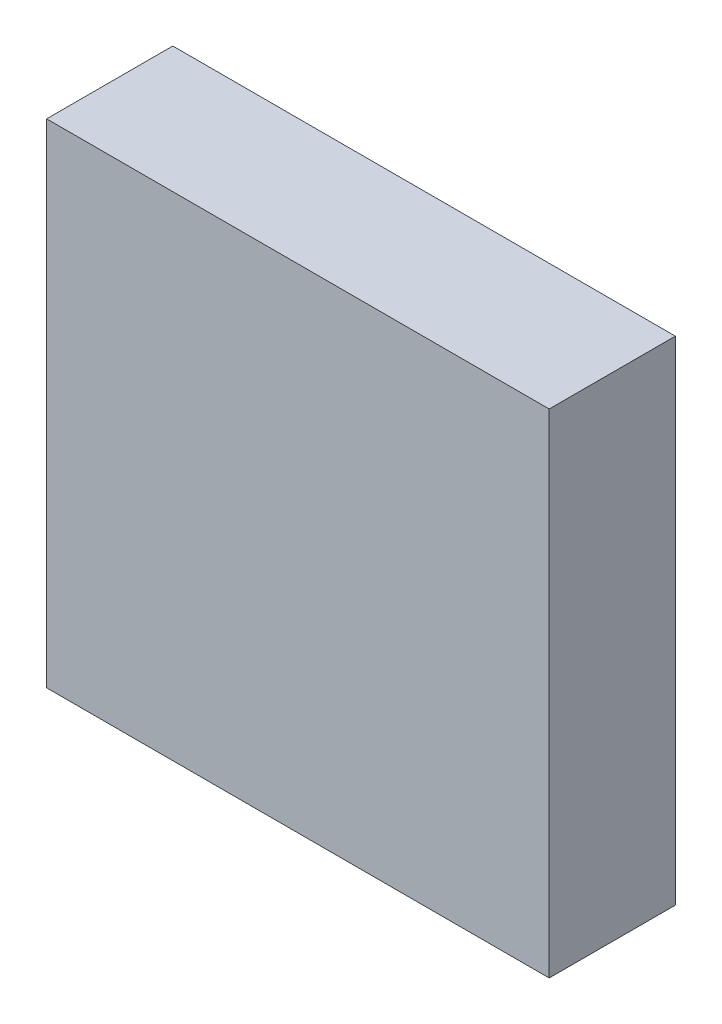
ISO-10303-21;
HEADER;
FILE_DESCRIPTION(('STEP AP214'),'2;1');
FILE_NAME('part.step','',(''),(''),'','','');
FILE_SCHEMA(('AUTOMOTIVE_DESIGN { 1 0 10303 214 1 1 1 1 }'));
ENDSEC;
DATA;
#1=APPLICATION_CONTEXT('core data for automotive mechanical design processes');
#2=APPLICATION_PROTOCOL_DEFINITION('international standard','automotive_design',2000,#1);
#3=PRODUCT_CONTEXT('',#1,'mechanical');
#4=PRODUCT('Part','Part','',(#3));
#5=PRODUCT_RELATED_PRODUCT_CATEGORY('part','',(#4));
#6=PRODUCT_DEFINITION_FORMATION('','',#4);
#7=PRODUCT_DEFINITION_CONTEXT('part definition',#1,'design');
#8=PRODUCT_DEFINITION('design','',#6,#7);
#9=PRODUCT_DEFINITION_SHAPE('','',#8);
#10=(LENGTH_UNIT() NAMED_UNIT(*) SI_UNIT(.MILLI.,.METRE.));
#11=(NAMED_UNIT(*) PLANE_ANGLE_UNIT() SI_UNIT($,.RADIAN.));
#12=(NAMED_UNIT(*) SI_UNIT($,.STERADIAN.) SOLID_ANGLE_UNIT());
#13=UNCERTAINTY_MEASURE_WITH_UNIT(LENGTH_MEASURE(1.E-05),#10,'distance_accuracy_value','');
#14=(GEOMETRIC_REPRESENTATION_CONTEXT(3) GLOBAL_UNCERTAINTY_ASSIGNED_CONTEXT((#13)) GLOBAL_UNIT_ASSIGNED_CONTEXT((#10,
#11,#12)) REPRESENTATION_CONTEXT('',''));
#15=CARTESIAN_POINT('',(0.,0.,0.));
#16=DIRECTION('',(0.,0.,1.));
#17=DIRECTION('',(1.,0.,0.));
#18=AXIS2_PLACEMENT_3D('',#15,#16,#17);
#19=CARTESIAN_POINT('',(9.19588534590375,13.0143538111531,1.7018));
#20=DIRECTION('',(-1.,0.,0.));
#21=DIRECTION('',(0.,0.,1.));
#22=AXIS2_PLACEMENT_3D('',#19,#20,#21);
#23=PLANE('',#22);
#24=DIRECTION('',(0.,1.,0.));
#25=VECTOR('',#24,1.);
#26=CARTESIAN_POINT('',(9.19588534590375,9.10805819782398,1.7018));
#27=LINE('',#26,#25);
#28=CARTESIAN_POINT('',(9.19588534590375,9.10805819782398,1.7018));
#29=VERTEX_POINT('',#28);
#30=CARTESIAN_POINT('',(9.19588534590375,13.0143538111531,1.7018));
#31=VERTEX_POINT('',#30);
#32=EDGE_CURVE('E75',#29,#31,#27,.T.);
#33=ORIENTED_EDGE('',*,*,#32,.F.);
#34=DIRECTION('',(0.,0.,1.));
#35=VECTOR('',#34,1.);
#36=CARTESIAN_POINT('',(9.19588534590375,9.10805819782398,1.7018));
#37=LINE('',#36,#35);
#38=CARTESIAN_POINT('',(9.19588534590375,9.10805819782398,2.7018));
#39=VERTEX_POINT('',#38);
#40=EDGE_CURVE('E69',#29,#39,#37,.T.);
#41=ORIENTED_EDGE('',*,*,#40,.T.);
#42=DIRECTION('',(0.,-1.,0.));
#43=VECTOR('',#42,1.);
#44=CARTESIAN_POINT('',(9.19588534590375,9.10805819782398,2.7018));
#45=LINE('',#44,#43);
#46=CARTESIAN_POINT('',(9.19588534590375,13.0143538111531,2.7018));
#47=VERTEX_POINT('',#46);
#48=EDGE_CURVE('E71',#47,#39,#45,.T.);
#49=ORIENTED_EDGE('',*,*,#48,.F.);
#50=DIRECTION('',(0.,0.,1.));
#51=VECTOR('',#50,1.);
#52=CARTESIAN_POINT('',(9.19588534590375,13.0143538111531,1.7018));
#53=LINE('',#52,#51);
#54=EDGE_CURVE('E11',#31,#47,#53,.T.);
#55=ORIENTED_EDGE('',*,*,#54,.F.);
#56=EDGE_LOOP('',(#33,#41,#49,#55));
#57=FACE_BOUND('',#56,.T.);
#58=ADVANCED_FACE('F16',(#57),#23,.T.);
#59=CARTESIAN_POINT('',(13.1795333476156,13.0143538111531,1.7018));
#60=DIRECTION('',(0.,1.,0.));
#61=DIRECTION('',(1.,0.,0.));
#62=AXIS2_PLACEMENT_3D('',#59,#60,#61);
#63=PLANE('',#62);
#64=DIRECTION('',(1.,0.,0.));
#65=VECTOR('',#64,1.);
#66=CARTESIAN_POINT('',(9.19588534590375,13.0143538111531,1.7018));
#67=LINE('',#66,#65);
#68=CARTESIAN_POINT('',(13.1795333476156,13.0143538111531,1.7018));
#69=VERTEX_POINT('',#68);
#70=EDGE_CURVE('E97',#31,#69,#67,.T.);
#71=ORIENTED_EDGE('',*,*,#70,.F.);
#72=ORIENTED_EDGE('',*,*,#54,.T.);
#73=DIRECTION('',(-1.,0.,0.));
#74=VECTOR('',#73,1.);
#75=CARTESIAN_POINT('',(9.19588534590375,13.0143538111531,2.7018));
#76=LINE('',#75,#74);
#77=CARTESIAN_POINT('',(13.1795333476156,13.0143538111531,2.7018));
#78=VERTEX_POINT('',#77);
#79=EDGE_CURVE('E84',#78,#47,#76,.T.);
#80=ORIENTED_EDGE('',*,*,#79,.F.);
#81=DIRECTION('',(0.,0.,1.));
#82=VECTOR('',#81,1.);
#83=CARTESIAN_POINT('',(13.1795333476156,13.0143538111531,1.7018));
#84=LINE('',#83,#82);
#85=EDGE_CURVE('E27',#69,#78,#84,.T.);
#86=ORIENTED_EDGE('',*,*,#85,.F.);
#87=EDGE_LOOP('',(#71,#72,#80,#86));
#88=FACE_BOUND('',#87,.T.);
#89=ADVANCED_FACE('F18',(#88),#63,.T.);
#90=CARTESIAN_POINT('',(13.1795333476156,9.10805819782398,1.7018));
#91=DIRECTION('',(1.,0.,0.));
#92=DIRECTION('',(0.,1.,0.));
#93=AXIS2_PLACEMENT_3D('',#90,#91,#92);
#94=PLANE('',#93);
#95=DIRECTION('',(0.,-1.,0.));
#96=VECTOR('',#95,1.);
#97=CARTESIAN_POINT('',(13.1795333476156,13.0143538111531,1.7018));
#98=LINE('',#97,#96);
#99=CARTESIAN_POINT('',(13.1795333476156,9.10805819782398,1.7018));
#100=VERTEX_POINT('',#99);
#101=EDGE_CURVE('E89',#69,#100,#98,.T.);
#102=ORIENTED_EDGE('',*,*,#101,.F.);
#103=ORIENTED_EDGE('',*,*,#85,.T.);
#104=DIRECTION('',(0.,1.,0.));
#105=VECTOR('',#104,1.);
#106=CARTESIAN_POINT('',(13.1795333476156,13.0143538111531,2.7018));
#107=LINE('',#106,#105);
#108=CARTESIAN_POINT('',(13.1795333476156,9.10805819782398,2.7018));
#109=VERTEX_POINT('',#108);
#110=EDGE_CURVE('E20',#109,#78,#107,.T.);
#111=ORIENTED_EDGE('',*,*,#110,.F.);
#112=DIRECTION('',(0.,0.,1.));
#113=VECTOR('',#112,1.);
#114=CARTESIAN_POINT('',(13.1795333476156,9.10805819782398,1.7018));
#115=LINE('',#114,#113);
#116=EDGE_CURVE('E60',#100,#109,#115,.T.);
#117=ORIENTED_EDGE('',*,*,#116,.F.);
#118=EDGE_LOOP('',(#102,#103,#111,#117));
#119=FACE_BOUND('',#118,.T.);
#120=ADVANCED_FACE('F151',(#119),#94,.T.);
#121=CARTESIAN_POINT('',(9.19588534590375,9.10805819782398,1.7018));
#122=DIRECTION('',(0.,-1.,0.));
#123=DIRECTION('',(0.,0.,-1.));
#124=AXIS2_PLACEMENT_3D('',#121,#122,#123);
#125=PLANE('',#124);
#126=DIRECTION('',(-1.,0.,0.));
#127=VECTOR('',#126,1.);
#128=CARTESIAN_POINT('',(13.1795333476156,9.10805819782398,1.7018));
#129=LINE('',#128,#127);
#130=EDGE_CURVE('E254',#100,#29,#129,.T.);
#131=ORIENTED_EDGE('',*,*,#130,.F.);
#132=ORIENTED_EDGE('',*,*,#116,.T.);
#133=DIRECTION('',(1.,0.,0.));
#134=VECTOR('',#133,1.);
#135=CARTESIAN_POINT('',(13.1795333476156,9.10805819782398,2.7018));
#136=LINE('',#135,#134);
#137=EDGE_CURVE('E83',#39,#109,#136,.T.);
#138=ORIENTED_EDGE('',*,*,#137,.F.);
#139=ORIENTED_EDGE('',*,*,#40,.F.);
#140=EDGE_LOOP('',(#131,#132,#138,#139));
#141=FACE_BOUND('',#140,.T.);
#142=ADVANCED_FACE('F87',(#141),#125,.T.);
#143=CARTESIAN_POINT('',(11.1877093467597,11.0612060044885,2.7018));
#144=DIRECTION('',(0.,0.,1.));
#145=DIRECTION('',(1.,0.,0.));
#146=AXIS2_PLACEMENT_3D('',#143,#144,#145);
#147=PLANE('',#146);
#148=ORIENTED_EDGE('',*,*,#137,.T.);
#149=ORIENTED_EDGE('',*,*,#110,.T.);
#150=ORIENTED_EDGE('',*,*,#79,.T.);
#151=ORIENTED_EDGE('',*,*,#48,.T.);
#152=EDGE_LOOP('',(#148,#149,#150,#151));
#153=FACE_BOUND('',#152,.T.);
#154=ADVANCED_FACE('F81',(#153),#147,.T.);
#155=CARTESIAN_POINT('',(11.1877093467597,11.0612060044885,1.7018));
#156=DIRECTION('',(0.,0.,1.));
#157=DIRECTION('',(1.,0.,0.));
#158=AXIS2_PLACEMENT_3D('',#155,#156,#157);
#159=PLANE('',#158);
#160=ORIENTED_EDGE('',*,*,#130,.T.);
#161=ORIENTED_EDGE('',*,*,#32,.T.);
#162=ORIENTED_EDGE('',*,*,#70,.T.);
#163=ORIENTED_EDGE('',*,*,#101,.T.);
#164=EDGE_LOOP('',(#160,#161,#162,#163));
#165=FACE_BOUND('',#164,.T.);
#166=ADVANCED_FACE('F143',(#165),#159,.F.);
#167=CLOSED_SHELL('',(#58,#89,#120,#142,#154,#166));
#168=MANIFOLD_SOLID_BREP('B1',#167);
#169=ADVANCED_BREP_SHAPE_REPRESENTATION('',(#18,#168),#14);
#170=SHAPE_DEFINITION_REPRESENTATION(#9,#169);
ENDSEC;
END-ISO-10303-21;
